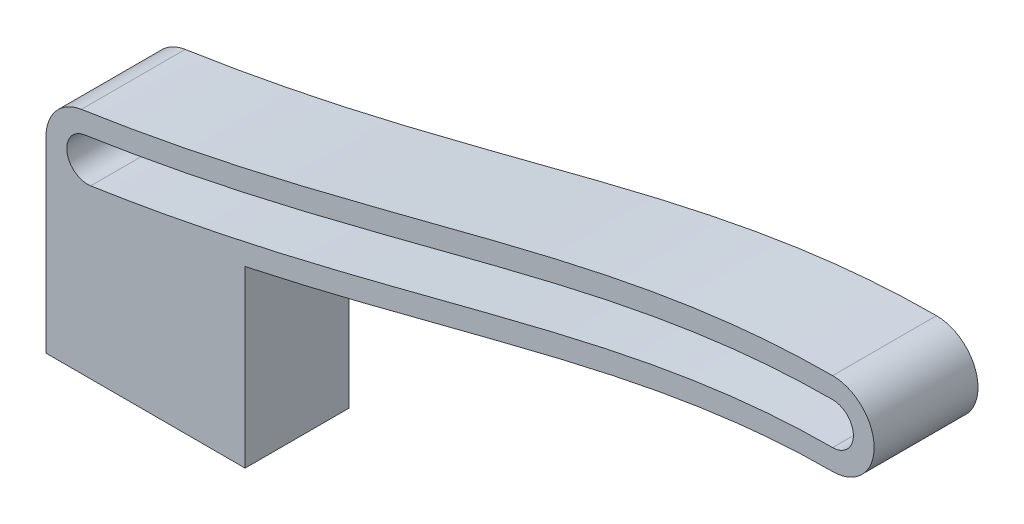
ISO-10303-21;
HEADER;
FILE_DESCRIPTION(('STEP AP214'),'2;1');
FILE_NAME('part.step','',(''),(''),'','','');
FILE_SCHEMA(('AUTOMOTIVE_DESIGN { 1 0 10303 214 1 1 1 1 }'));
ENDSEC;
DATA;
#1=APPLICATION_CONTEXT('core data for automotive mechanical design processes');
#2=APPLICATION_PROTOCOL_DEFINITION('international standard','automotive_design',2000,#1);
#3=PRODUCT_CONTEXT('',#1,'mechanical');
#4=PRODUCT('Part','Part','',(#3));
#5=PRODUCT_RELATED_PRODUCT_CATEGORY('part','',(#4));
#6=PRODUCT_DEFINITION_FORMATION('','',#4);
#7=PRODUCT_DEFINITION_CONTEXT('part definition',#1,'design');
#8=PRODUCT_DEFINITION('design','',#6,#7);
#9=PRODUCT_DEFINITION_SHAPE('','',#8);
#10=(LENGTH_UNIT() NAMED_UNIT(*) SI_UNIT(.MILLI.,.METRE.));
#11=(NAMED_UNIT(*) PLANE_ANGLE_UNIT() SI_UNIT($,.RADIAN.));
#12=(NAMED_UNIT(*) SI_UNIT($,.STERADIAN.) SOLID_ANGLE_UNIT());
#13=UNCERTAINTY_MEASURE_WITH_UNIT(LENGTH_MEASURE(1.E-05),#10,'distance_accuracy_value','');
#14=(GEOMETRIC_REPRESENTATION_CONTEXT(3) GLOBAL_UNCERTAINTY_ASSIGNED_CONTEXT((#13)) GLOBAL_UNIT_ASSIGNED_CONTEXT((#10,
#11,#12)) REPRESENTATION_CONTEXT('',''));
#15=CARTESIAN_POINT('',(0.,0.,0.));
#16=DIRECTION('',(0.,0.,1.));
#17=DIRECTION('',(1.,0.,0.));
#18=AXIS2_PLACEMENT_3D('',#15,#16,#17);
#19=CARTESIAN_POINT('',(28.2842714970209,14.,5.));
#20=CARTESIAN_POINT('',(26.832248758877,13.9999998188174,5.));
#21=CARTESIAN_POINT('',(23.9423225455337,13.8183891428839,5.));
#22=CARTESIAN_POINT('',(18.107055453602,12.9063002409444,5.));
#23=CARTESIAN_POINT('',(10.8077232532107,11.0575589964245,5.));
#24=CARTESIAN_POINT('',(1.88654652664922,8.72775433794972,5.));
#25=CARTESIAN_POINT('',(-4.22190772216682,7.5244570778429,5.));
#26=CARTESIAN_POINT('',(-7.28740261325595,7.0623874034193,5.));
#27=B_SPLINE_CURVE_WITH_KNOTS('',3,(#19,#20,#21,#22,#23,#24,#25,#26),.UNSPECIFIED.,.F.,.F.,(4,1,
1,1,1,4),(0.,0.085588552372334,0.171177104744668,0.342354209489336,0.513531314234004,
0.684708418978672),.UNSPECIFIED.);
#28=DIRECTION('',(0.,0.,-1.));
#29=VECTOR('',#28,1.);
#30=SURFACE_OF_LINEAR_EXTRUSION('',#27,#29);
#31=CARTESIAN_POINT('',(28.2842714970209,14.,5.));
#32=VERTEX_POINT('',#31);
#33=CARTESIAN_POINT('',(1.2490009027033E-13,8.40550280615225,5.));
#34=VERTEX_POINT('',#33);
#35=EDGE_CURVE('E69',#32,#34,#27,.T.);
#36=ORIENTED_EDGE('',*,*,#35,.T.);
#37=DIRECTION('',(0.,0.,-1.));
#38=VECTOR('',#37,1.);
#39=CARTESIAN_POINT('',(0.,8.40550280615222,18.1758971274392));
#40=LINE('',#39,#38);
#41=CARTESIAN_POINT('',(1.2490009027033E-13,8.40550280615225,0.));
#42=VERTEX_POINT('',#41);
#43=EDGE_CURVE('E161',#34,#42,#40,.T.);
#44=ORIENTED_EDGE('',*,*,#43,.T.);
#45=CARTESIAN_POINT('',(28.2842714970209,14.,0.));
#46=CARTESIAN_POINT('',(26.832248758877,13.9999998188174,0.));
#47=CARTESIAN_POINT('',(23.9423225455337,13.8183891428839,0.));
#48=CARTESIAN_POINT('',(18.107055453602,12.9063002409444,0.));
#49=CARTESIAN_POINT('',(10.8077232532107,11.0575589964245,0.));
#50=CARTESIAN_POINT('',(1.88654652664922,8.72775433794972,0.));
#51=CARTESIAN_POINT('',(-4.22190772216682,7.5244570778429,0.));
#52=CARTESIAN_POINT('',(-7.28740261325595,7.0623874034193,0.));
#53=B_SPLINE_CURVE_WITH_KNOTS('',3,(#45,#46,#47,#48,#49,#50,#51,#52),.UNSPECIFIED.,.F.,.F.,(4,1,
1,1,1,4),(0.,0.085588552372334,0.171177104744668,0.342354209489336,0.513531314234004,
0.684708418978672),.UNSPECIFIED.);
#54=CARTESIAN_POINT('',(28.2842714970209,14.,0.));
#55=VERTEX_POINT('',#54);
#56=EDGE_CURVE('E180',#55,#42,#53,.T.);
#57=ORIENTED_EDGE('',*,*,#56,.F.);
#58=DIRECTION('',(0.,0.,-1.));
#59=VECTOR('',#58,1.);
#60=CARTESIAN_POINT('',(28.2842714970209,14.,5.));
#61=LINE('',#60,#59);
#62=EDGE_CURVE('E251',#32,#55,#61,.T.);
#63=ORIENTED_EDGE('',*,*,#62,.F.);
#64=EDGE_LOOP('',(#36,#44,#57,#63));
#65=FACE_BOUND('',#64,.T.);
#66=ADVANCED_FACE('F43',(#65),#30,.T.);
#67=CARTESIAN_POINT('',(-7.58550018005083,9.04004709119952,5.));
#68=DIRECTION('',(0.,0.,-1.));
#69=DIRECTION('',(-1.,0.,0.));
#70=AXIS2_PLACEMENT_3D('',#67,#68,#69);
#71=CYLINDRICAL_SURFACE('',#70,2.);
#72=DIRECTION('',(0.,0.,-1.));
#73=VECTOR('',#72,1.);
#74=CARTESIAN_POINT('',(-9.58550018005083,9.04004709119952,18.1758971274392));
#75=LINE('',#74,#73);
#76=CARTESIAN_POINT('',(-9.58550018005083,9.04004709119952,5.));
#77=VERTEX_POINT('',#76);
#78=CARTESIAN_POINT('',(-9.58550018005083,9.04004709119952,0.));
#79=VERTEX_POINT('',#78);
#80=EDGE_CURVE('E61',#77,#79,#75,.T.);
#81=ORIENTED_EDGE('',*,*,#80,.F.);
#82=CARTESIAN_POINT('',(-7.58550018005083,9.04004709119952,5.));
#83=DIRECTION('',(0.,0.,1.));
#84=DIRECTION('',(1.,0.,0.));
#85=AXIS2_PLACEMENT_3D('',#82,#83,#84);
#86=CIRCLE('',#85,2.);
#87=CARTESIAN_POINT('',(-7.8835977468441,11.01770677898,5.));
#88=VERTEX_POINT('',#87);
#89=EDGE_CURVE('E136',#88,#77,#86,.T.);
#90=ORIENTED_EDGE('',*,*,#89,.F.);
#91=DIRECTION('',(0.,0.,-1.));
#92=VECTOR('',#91,1.);
#93=CARTESIAN_POINT('',(-7.8835977468441,11.01770677898,5.));
#94=LINE('',#93,#92);
#95=CARTESIAN_POINT('',(-7.8835977468441,11.01770677898,0.));
#96=VERTEX_POINT('',#95);
#97=EDGE_CURVE('E256',#88,#96,#94,.T.);
#98=ORIENTED_EDGE('',*,*,#97,.T.);
#99=CARTESIAN_POINT('',(-7.58550018005083,9.04004709119952,0.));
#100=DIRECTION('',(0.,0.,1.));
#101=DIRECTION('',(1.,0.,0.));
#102=AXIS2_PLACEMENT_3D('',#99,#100,#101);
#103=CIRCLE('',#102,2.);
#104=EDGE_CURVE('E208',#96,#79,#103,.T.);
#105=ORIENTED_EDGE('',*,*,#104,.T.);
#106=EDGE_LOOP('',(#81,#90,#98,#105));
#107=FACE_BOUND('',#106,.T.);
#108=ADVANCED_FACE('F290',(#107),#71,.T.);
#109=CARTESIAN_POINT('',(28.2842712474619,16.,5.));
#110=DIRECTION('',(0.,0.,-1.));
#111=DIRECTION('',(-1.,0.,0.));
#112=AXIS2_PLACEMENT_3D('',#109,#110,#111);
#113=CYLINDRICAL_SURFACE('',#112,0.999999999999999);
#114=CARTESIAN_POINT('',(28.2842712474619,16.,0.));
#115=DIRECTION('',(0.,0.,1.));
#116=DIRECTION('',(1.,0.,0.));
#117=AXIS2_PLACEMENT_3D('',#114,#115,#116);
#118=CIRCLE('',#117,0.999999999999999);
#119=CARTESIAN_POINT('',(28.2842711226824,17.,0.));
#120=VERTEX_POINT('',#119);
#121=CARTESIAN_POINT('',(28.2842713722414,15.,0.));
#122=VERTEX_POINT('',#121);
#123=EDGE_CURVE('E222',#120,#122,#118,.F.);
#124=ORIENTED_EDGE('',*,*,#123,.T.);
#125=DIRECTION('',(0.,0.,-1.));
#126=VECTOR('',#125,1.);
#127=CARTESIAN_POINT('',(28.2842713722414,15.,5.));
#128=LINE('',#127,#126);
#129=CARTESIAN_POINT('',(28.2842713722414,15.,5.));
#130=VERTEX_POINT('',#129);
#131=EDGE_CURVE('E11',#130,#122,#128,.T.);
#132=ORIENTED_EDGE('',*,*,#131,.F.);
#133=CARTESIAN_POINT('',(28.2842712474619,16.,5.));
#134=DIRECTION('',(0.,0.,1.));
#135=DIRECTION('',(1.,0.,0.));
#136=AXIS2_PLACEMENT_3D('',#133,#134,#135);
#137=CIRCLE('',#136,0.999999999999999);
#138=CARTESIAN_POINT('',(28.2842711226824,17.,5.));
#139=VERTEX_POINT('',#138);
#140=EDGE_CURVE('E275',#139,#130,#137,.F.);
#141=ORIENTED_EDGE('',*,*,#140,.F.);
#142=DIRECTION('',(0.,0.,-1.));
#143=VECTOR('',#142,1.);
#144=CARTESIAN_POINT('',(28.2842711226824,17.,5.));
#145=LINE('',#144,#143);
#146=EDGE_CURVE('E244',#139,#120,#145,.T.);
#147=ORIENTED_EDGE('',*,*,#146,.T.);
#148=EDGE_LOOP('',(#124,#132,#141,#147));
#149=FACE_BOUND('',#148,.T.);
#150=ADVANCED_FACE('F304',(#149),#113,.F.);
#151=CARTESIAN_POINT('',(28.2842713722414,15.,5.));
#152=CARTESIAN_POINT('',(25.2999915187581,14.999999627623,5.));
#153=CARTESIAN_POINT('',(19.3680410639554,14.2561212160544,5.));
#154=CARTESIAN_POINT('',(10.5412519545643,12.0217828058504,5.));
#155=CARTESIAN_POINT('',(1.65534743450986,9.70130170147574,5.));
#156=CARTESIAN_POINT('',(-4.39567006054546,8.5095617860829,5.));
#157=CARTESIAN_POINT('',(-7.43645139665299,8.05121724730947,5.));
#158=B_SPLINE_CURVE_WITH_KNOTS('',3,(#151,#152,#153,#154,#155,#156,#157),.UNSPECIFIED.,.F.,.F.,
(4,1,1,1,4),(0.,0.171177104744668,0.342354209489336,0.513531314234004,0.684708418978672),.UNSPECIFIED.);
#159=DIRECTION('',(0.,0.,-1.));
#160=VECTOR('',#159,1.);
#161=SURFACE_OF_LINEAR_EXTRUSION('',#158,#160);
#162=CARTESIAN_POINT('',(28.2842713722414,15.,0.));
#163=CARTESIAN_POINT('',(25.2999915187581,14.999999627623,0.));
#164=CARTESIAN_POINT('',(19.3680410639554,14.2561212160544,0.));
#165=CARTESIAN_POINT('',(10.5412519545643,12.0217828058504,0.));
#166=CARTESIAN_POINT('',(1.65534743450986,9.70130170147574,0.));
#167=CARTESIAN_POINT('',(-4.39567006054546,8.5095617860829,0.));
#168=CARTESIAN_POINT('',(-7.43645139665299,8.05121724730947,0.));
#169=B_SPLINE_CURVE_WITH_KNOTS('',3,(#162,#163,#164,#165,#166,#167,#168),.UNSPECIFIED.,.F.,.F.,
(4,1,1,1,4),(0.,0.171177104744668,0.342354209489336,0.513531314234004,0.684708418978672),.UNSPECIFIED.);
#170=CARTESIAN_POINT('',(-7.43645139665299,8.05121724730947,0.));
#171=VERTEX_POINT('',#170);
#172=EDGE_CURVE('E226',#122,#171,#169,.T.);
#173=ORIENTED_EDGE('',*,*,#172,.T.);
#174=DIRECTION('',(0.,0.,-1.));
#175=VECTOR('',#174,1.);
#176=CARTESIAN_POINT('',(-7.43645139665299,8.05121724730947,5.));
#177=LINE('',#176,#175);
#178=CARTESIAN_POINT('',(-7.43645139665299,8.05121724730947,5.));
#179=VERTEX_POINT('',#178);
#180=EDGE_CURVE('E53',#179,#171,#177,.T.);
#181=ORIENTED_EDGE('',*,*,#180,.F.);
#182=EDGE_CURVE('E316',#130,#179,#158,.T.);
#183=ORIENTED_EDGE('',*,*,#182,.F.);
#184=ORIENTED_EDGE('',*,*,#131,.T.);
#185=EDGE_LOOP('',(#173,#181,#183,#184));
#186=FACE_BOUND('',#185,.T.);
#187=ADVANCED_FACE('F297',(#186),#161,.F.);
#188=CARTESIAN_POINT('',(-7.58550018005083,9.04004709119952,5.));
#189=DIRECTION('',(0.,0.,-1.));
#190=DIRECTION('',(-1.,0.,0.));
#191=AXIS2_PLACEMENT_3D('',#188,#189,#190);
#192=CYLINDRICAL_SURFACE('',#191,1.);
#193=CARTESIAN_POINT('',(-7.58550018005083,9.04004709119952,0.));
#194=DIRECTION('',(0.,0.,1.));
#195=DIRECTION('',(1.,0.,0.));
#196=AXIS2_PLACEMENT_3D('',#193,#194,#195);
#197=CIRCLE('',#196,1.);
#198=CARTESIAN_POINT('',(-7.73454896344706,10.0288769350898,0.));
#199=VERTEX_POINT('',#198);
#200=EDGE_CURVE('E232',#199,#171,#197,.T.);
#201=ORIENTED_EDGE('',*,*,#200,.F.);
#202=DIRECTION('',(0.,0.,-1.));
#203=VECTOR('',#202,1.);
#204=CARTESIAN_POINT('',(-7.73454896344706,10.0288769350898,5.));
#205=LINE('',#204,#203);
#206=CARTESIAN_POINT('',(-7.73454896344706,10.0288769350898,5.));
#207=VERTEX_POINT('',#206);
#208=EDGE_CURVE('E250',#207,#199,#205,.T.);
#209=ORIENTED_EDGE('',*,*,#208,.F.);
#210=CARTESIAN_POINT('',(-7.58550018005083,9.04004709119952,5.));
#211=DIRECTION('',(0.,0.,1.));
#212=DIRECTION('',(1.,0.,0.));
#213=AXIS2_PLACEMENT_3D('',#210,#211,#212);
#214=CIRCLE('',#213,1.);
#215=EDGE_CURVE('E322',#207,#179,#214,.T.);
#216=ORIENTED_EDGE('',*,*,#215,.T.);
#217=ORIENTED_EDGE('',*,*,#180,.T.);
#218=EDGE_LOOP('',(#201,#209,#216,#217));
#219=FACE_BOUND('',#218,.T.);
#220=ADVANCED_FACE('F293',(#219),#192,.F.);
#221=CARTESIAN_POINT('',(28.2842712474619,16.,5.));
#222=DIRECTION('',(0.,0.,-1.));
#223=DIRECTION('',(-1.,0.,0.));
#224=AXIS2_PLACEMENT_3D('',#221,#222,#223);
#225=CYLINDRICAL_SURFACE('',#224,2.);
#226=CARTESIAN_POINT('',(28.2842712474619,16.,0.));
#227=DIRECTION('',(0.,0.,1.));
#228=DIRECTION('',(1.,0.,0.));
#229=AXIS2_PLACEMENT_3D('',#226,#227,#228);
#230=CIRCLE('',#229,2.);
#231=CARTESIAN_POINT('',(28.2842709979029,18.,0.));
#232=VERTEX_POINT('',#231);
#233=EDGE_CURVE('E198',#232,#55,#230,.F.);
#234=ORIENTED_EDGE('',*,*,#233,.F.);
#235=DIRECTION('',(0.,0.,-1.));
#236=VECTOR('',#235,1.);
#237=CARTESIAN_POINT('',(28.2842709979029,18.,5.));
#238=LINE('',#237,#236);
#239=CARTESIAN_POINT('',(28.2842709979029,18.,5.));
#240=VERTEX_POINT('',#239);
#241=EDGE_CURVE('E260',#240,#232,#238,.T.);
#242=ORIENTED_EDGE('',*,*,#241,.F.);
#243=CARTESIAN_POINT('',(28.2842712474619,16.,5.));
#244=DIRECTION('',(0.,0.,1.));
#245=DIRECTION('',(1.,0.,0.));
#246=AXIS2_PLACEMENT_3D('',#243,#244,#245);
#247=CIRCLE('',#246,2.);
#248=EDGE_CURVE('E169',#240,#32,#247,.F.);
#249=ORIENTED_EDGE('',*,*,#248,.T.);
#250=ORIENTED_EDGE('',*,*,#62,.T.);
#251=EDGE_LOOP('',(#234,#242,#249,#250));
#252=FACE_BOUND('',#251,.T.);
#253=ADVANCED_FACE('F266',(#252),#225,.T.);
#254=CARTESIAN_POINT('',(28.2842709979029,18.,5.));
#255=CARTESIAN_POINT('',(26.6869389263349,17.9999998006857,5.));
#256=CARTESIAN_POINT('',(23.4761671514383,17.7981086623525,5.));
#257=CARTESIAN_POINT('',(17.246191739159,16.8176675156641,5.));
#258=CARTESIAN_POINT('',(9.74876296594051,14.913893443983,5.));
#259=CARTESIAN_POINT('',(0.959771609808857,12.6221040173068,5.));
#260=CARTESIAN_POINT('',(-4.91695706789812,11.4648759119761,5.));
#261=CARTESIAN_POINT('',(-7.8835977468441,11.01770677898,5.));
#262=B_SPLINE_CURVE_WITH_KNOTS('',3,(#254,#255,#256,#257,#258,#259,#260,#261),.UNSPECIFIED.,.F.,
.F.,(4,1,1,1,1,4),(0.,0.085588552372334,0.171177104744668,0.342354209489336,0.513531314234004,
0.684708418978672),.UNSPECIFIED.);
#263=DIRECTION('',(0.,0.,-1.));
#264=VECTOR('',#263,1.);
#265=SURFACE_OF_LINEAR_EXTRUSION('',#262,#264);
#266=CARTESIAN_POINT('',(28.2842709979029,18.,0.));
#267=CARTESIAN_POINT('',(26.6869389263349,17.9999998006857,0.));
#268=CARTESIAN_POINT('',(23.4761671514383,17.7981086623525,0.));
#269=CARTESIAN_POINT('',(17.246191739159,16.8176675156641,0.));
#270=CARTESIAN_POINT('',(9.74876296594051,14.913893443983,0.));
#271=CARTESIAN_POINT('',(0.959771609808857,12.6221040173068,0.));
#272=CARTESIAN_POINT('',(-4.91695706789812,11.4648759119761,0.));
#273=CARTESIAN_POINT('',(-7.8835977468441,11.01770677898,0.));
#274=B_SPLINE_CURVE_WITH_KNOTS('',3,(#266,#267,#268,#269,#270,#271,#272,#273),.UNSPECIFIED.,.F.,
.F.,(4,1,1,1,1,4),(0.,0.085588552372334,0.171177104744668,0.342354209489336,0.513531314234004,
0.684708418978672),.UNSPECIFIED.);
#275=EDGE_CURVE('E203',#232,#96,#274,.T.);
#276=ORIENTED_EDGE('',*,*,#275,.T.);
#277=ORIENTED_EDGE('',*,*,#97,.F.);
#278=EDGE_CURVE('E270',#240,#88,#262,.T.);
#279=ORIENTED_EDGE('',*,*,#278,.F.);
#280=ORIENTED_EDGE('',*,*,#241,.T.);
#281=EDGE_LOOP('',(#276,#277,#279,#280));
#282=FACE_BOUND('',#281,.T.);
#283=ADVANCED_FACE('F285',(#282),#265,.F.);
#284=CARTESIAN_POINT('',(28.2842711226824,17.,5.));
#285=CARTESIAN_POINT('',(26.7232663945352,16.9999998052186,5.));
#286=CARTESIAN_POINT('',(23.5927059954043,16.8031787824844,5.));
#287=CARTESIAN_POINT('',(17.4614076704296,15.839825696989,5.));
#288=CARTESIAN_POINT('',(10.0135030366086,13.9498098320554,5.));
#289=CARTESIAN_POINT('',(1.19146534019507,11.6485165976061,5.));
#290=CARTESIAN_POINT('',(-4.74319473344326,10.4797712031447,5.));
#291=CARTESIAN_POINT('',(-7.73454896344706,10.0288769350898,5.));
#292=B_SPLINE_CURVE_WITH_KNOTS('',3,(#284,#285,#286,#287,#288,#289,#290,#291),.UNSPECIFIED.,.F.,
.F.,(4,1,1,1,1,4),(0.,0.085588552372334,0.171177104744668,0.342354209489336,0.513531314234004,
0.684708418978672),.UNSPECIFIED.);
#293=DIRECTION('',(0.,0.,-1.));
#294=VECTOR('',#293,1.);
#295=SURFACE_OF_LINEAR_EXTRUSION('',#292,#294);
#296=CARTESIAN_POINT('',(28.2842711226824,17.,0.));
#297=CARTESIAN_POINT('',(26.7232663945352,16.9999998052186,0.));
#298=CARTESIAN_POINT('',(23.5927059954043,16.8031787824844,0.));
#299=CARTESIAN_POINT('',(17.4614076704296,15.839825696989,0.));
#300=CARTESIAN_POINT('',(10.0135030366086,13.9498098320554,0.));
#301=CARTESIAN_POINT('',(1.19146534019507,11.6485165976061,0.));
#302=CARTESIAN_POINT('',(-4.74319473344326,10.4797712031447,0.));
#303=CARTESIAN_POINT('',(-7.73454896344706,10.0288769350898,0.));
#304=B_SPLINE_CURVE_WITH_KNOTS('',3,(#296,#297,#298,#299,#300,#301,#302,#303),.UNSPECIFIED.,.F.,
.F.,(4,1,1,1,1,4),(0.,0.085588552372334,0.171177104744668,0.342354209489336,0.513531314234004,
0.684708418978672),.UNSPECIFIED.);
#305=EDGE_CURVE('E179',#120,#199,#304,.T.);
#306=ORIENTED_EDGE('',*,*,#305,.F.);
#307=ORIENTED_EDGE('',*,*,#146,.F.);
#308=EDGE_CURVE('E261',#139,#207,#292,.T.);
#309=ORIENTED_EDGE('',*,*,#308,.T.);
#310=ORIENTED_EDGE('',*,*,#208,.T.);
#311=EDGE_LOOP('',(#306,#307,#309,#310));
#312=FACE_BOUND('',#311,.T.);
#313=ADVANCED_FACE('F288',(#312),#295,.T.);
#314=CARTESIAN_POINT('',(0.,0.,5.));
#315=DIRECTION('',(0.,0.,1.));
#316=DIRECTION('',(1.,0.,0.));
#317=AXIS2_PLACEMENT_3D('',#314,#315,#316);
#318=PLANE('',#317);
#319=ORIENTED_EDGE('',*,*,#35,.F.);
#320=ORIENTED_EDGE('',*,*,#248,.F.);
#321=ORIENTED_EDGE('',*,*,#278,.T.);
#322=ORIENTED_EDGE('',*,*,#89,.T.);
#323=DIRECTION('',(0.,1.,0.));
#324=VECTOR('',#323,1.);
#325=CARTESIAN_POINT('',(-9.58550018005083,0.,5.));
#326=LINE('',#325,#324);
#327=CARTESIAN_POINT('',(-9.58550018005083,0.,5.));
#328=VERTEX_POINT('',#327);
#329=EDGE_CURVE('E129',#328,#77,#326,.T.);
#330=ORIENTED_EDGE('',*,*,#329,.F.);
#331=DIRECTION('',(-1.,0.,0.));
#332=VECTOR('',#331,1.);
#333=CARTESIAN_POINT('',(0.,0.,5.));
#334=LINE('',#333,#332);
#335=CARTESIAN_POINT('',(0.,0.,5.));
#336=VERTEX_POINT('',#335);
#337=EDGE_CURVE('E134',#336,#328,#334,.T.);
#338=ORIENTED_EDGE('',*,*,#337,.F.);
#339=DIRECTION('',(0.,1.,0.));
#340=VECTOR('',#339,1.);
#341=CARTESIAN_POINT('',(0.,0.,5.));
#342=LINE('',#341,#340);
#343=EDGE_CURVE('E183',#336,#34,#342,.T.);
#344=ORIENTED_EDGE('',*,*,#343,.T.);
#345=EDGE_LOOP('',(#319,#320,#321,#322,#330,#338,#344));
#346=FACE_BOUND('',#345,.T.);
#347=ORIENTED_EDGE('',*,*,#140,.T.);
#348=ORIENTED_EDGE('',*,*,#182,.T.);
#349=ORIENTED_EDGE('',*,*,#215,.F.);
#350=ORIENTED_EDGE('',*,*,#308,.F.);
#351=EDGE_LOOP('',(#347,#348,#349,#350));
#352=FACE_BOUND('',#351,.T.);
#353=ADVANCED_FACE('F131',(#346,#352),#318,.T.);
#354=CARTESIAN_POINT('',(0.,0.,0.));
#355=DIRECTION('',(0.,0.,1.));
#356=DIRECTION('',(1.,0.,0.));
#357=AXIS2_PLACEMENT_3D('',#354,#355,#356);
#358=PLANE('',#357);
#359=ORIENTED_EDGE('',*,*,#56,.T.);
#360=DIRECTION('',(0.,1.,0.));
#361=VECTOR('',#360,1.);
#362=CARTESIAN_POINT('',(0.,0.,0.));
#363=LINE('',#362,#361);
#364=CARTESIAN_POINT('',(0.,0.,0.));
#365=VERTEX_POINT('',#364);
#366=EDGE_CURVE('E164',#365,#42,#363,.T.);
#367=ORIENTED_EDGE('',*,*,#366,.F.);
#368=DIRECTION('',(-1.,0.,0.));
#369=VECTOR('',#368,1.);
#370=CARTESIAN_POINT('',(0.,0.,0.));
#371=LINE('',#370,#369);
#372=CARTESIAN_POINT('',(-9.58550018005083,0.,0.));
#373=VERTEX_POINT('',#372);
#374=EDGE_CURVE('E156',#365,#373,#371,.T.);
#375=ORIENTED_EDGE('',*,*,#374,.T.);
#376=DIRECTION('',(0.,1.,0.));
#377=VECTOR('',#376,1.);
#378=CARTESIAN_POINT('',(-9.58550018005083,0.,0.));
#379=LINE('',#378,#377);
#380=EDGE_CURVE('E144',#373,#79,#379,.T.);
#381=ORIENTED_EDGE('',*,*,#380,.T.);
#382=ORIENTED_EDGE('',*,*,#104,.F.);
#383=ORIENTED_EDGE('',*,*,#275,.F.);
#384=ORIENTED_EDGE('',*,*,#233,.T.);
#385=EDGE_LOOP('',(#359,#367,#375,#381,#382,#383,#384));
#386=FACE_BOUND('',#385,.T.);
#387=ORIENTED_EDGE('',*,*,#123,.F.);
#388=ORIENTED_EDGE('',*,*,#305,.T.);
#389=ORIENTED_EDGE('',*,*,#200,.T.);
#390=ORIENTED_EDGE('',*,*,#172,.F.);
#391=EDGE_LOOP('',(#387,#388,#389,#390));
#392=FACE_BOUND('',#391,.T.);
#393=ADVANCED_FACE('F339',(#386,#392),#358,.F.);
#394=CARTESIAN_POINT('',(0.,0.,18.1758971274392));
#395=DIRECTION('',(0.,-1.,0.));
#396=DIRECTION('',(1.,0.,0.));
#397=AXIS2_PLACEMENT_3D('',#394,#395,#396);
#398=PLANE('',#397);
#399=DIRECTION('',(0.,0.,-1.));
#400=VECTOR('',#399,1.);
#401=CARTESIAN_POINT('',(0.,0.,18.1758971274392));
#402=LINE('',#401,#400);
#403=EDGE_CURVE('E152',#336,#365,#402,.T.);
#404=ORIENTED_EDGE('',*,*,#403,.F.);
#405=ORIENTED_EDGE('',*,*,#337,.T.);
#406=DIRECTION('',(0.,0.,-1.));
#407=VECTOR('',#406,1.);
#408=CARTESIAN_POINT('',(-9.58550018005083,0.,18.1758971274392));
#409=LINE('',#408,#407);
#410=EDGE_CURVE('E139',#328,#373,#409,.T.);
#411=ORIENTED_EDGE('',*,*,#410,.T.);
#412=ORIENTED_EDGE('',*,*,#374,.F.);
#413=EDGE_LOOP('',(#404,#405,#411,#412));
#414=FACE_BOUND('',#413,.T.);
#415=ADVANCED_FACE('F151',(#414),#398,.T.);
#416=CARTESIAN_POINT('',(-9.58550018005083,0.,18.1758971274392));
#417=DIRECTION('',(-1.,0.,0.));
#418=DIRECTION('',(0.,0.,1.));
#419=AXIS2_PLACEMENT_3D('',#416,#417,#418);
#420=PLANE('',#419);
#421=ORIENTED_EDGE('',*,*,#410,.F.);
#422=ORIENTED_EDGE('',*,*,#329,.T.);
#423=ORIENTED_EDGE('',*,*,#80,.T.);
#424=ORIENTED_EDGE('',*,*,#380,.F.);
#425=EDGE_LOOP('',(#421,#422,#423,#424));
#426=FACE_BOUND('',#425,.T.);
#427=ADVANCED_FACE('F142',(#426),#420,.T.);
#428=CARTESIAN_POINT('',(0.,0.,18.1758971274392));
#429=DIRECTION('',(-1.,0.,0.));
#430=DIRECTION('',(0.,-1.,0.));
#431=AXIS2_PLACEMENT_3D('',#428,#429,#430);
#432=PLANE('',#431);
#433=ORIENTED_EDGE('',*,*,#343,.F.);
#434=ORIENTED_EDGE('',*,*,#403,.T.);
#435=ORIENTED_EDGE('',*,*,#366,.T.);
#436=ORIENTED_EDGE('',*,*,#43,.F.);
#437=EDGE_LOOP('',(#433,#434,#435,#436));
#438=FACE_BOUND('',#437,.T.);
#439=ADVANCED_FACE('F268',(#438),#432,.F.);
#440=CLOSED_SHELL('',(#66,#108,#150,#187,#220,#253,#283,#313,#353,#393,#415,#427,#439));
#441=MANIFOLD_SOLID_BREP('B2',#440);
#442=ADVANCED_BREP_SHAPE_REPRESENTATION('',(#18,#441),#14);
#443=SHAPE_DEFINITION_REPRESENTATION(#9,#442);
ENDSEC;
END-ISO-10303-21;
